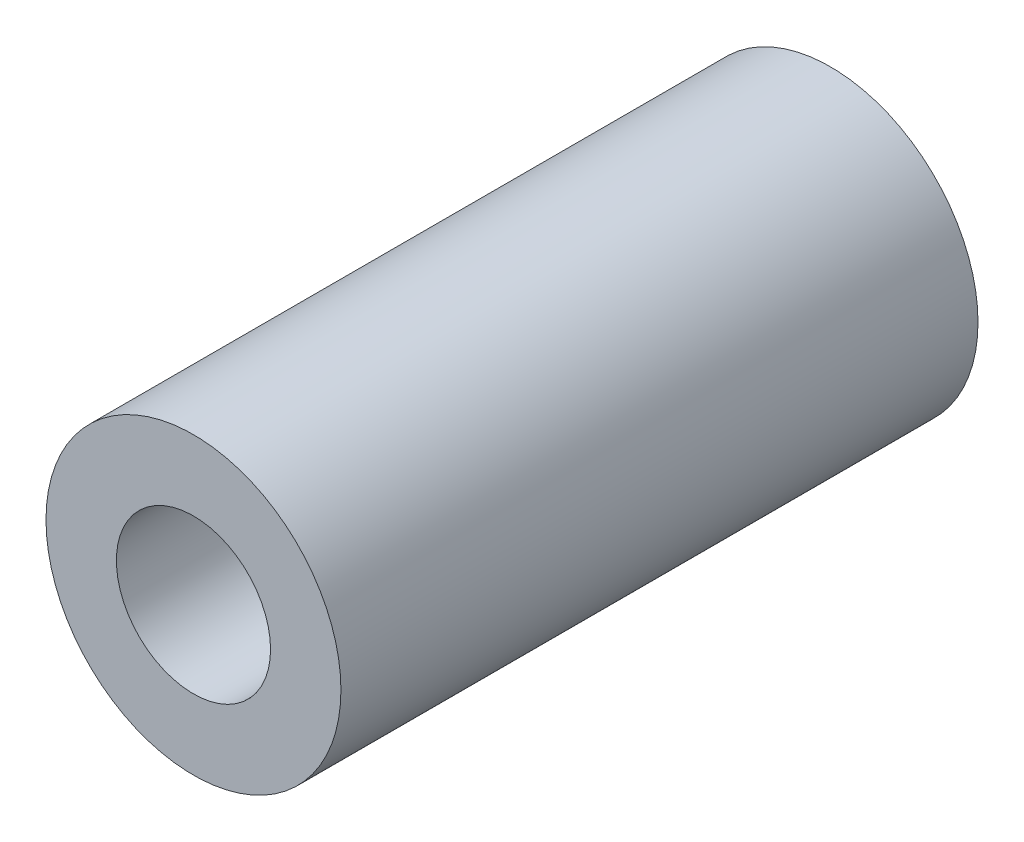
ISO-10303-21;
HEADER;
FILE_DESCRIPTION(('STEP AP214'),'2;1');
FILE_NAME('part.step','',(''),(''),'','','');
FILE_SCHEMA(('AUTOMOTIVE_DESIGN { 1 0 10303 214 1 1 1 1 }'));
ENDSEC;
DATA;
#1=APPLICATION_CONTEXT('core data for automotive mechanical design processes');
#2=APPLICATION_PROTOCOL_DEFINITION('international standard','automotive_design',2000,#1);
#3=PRODUCT_CONTEXT('',#1,'mechanical');
#4=PRODUCT('Part','Part','',(#3));
#5=PRODUCT_RELATED_PRODUCT_CATEGORY('part','',(#4));
#6=PRODUCT_DEFINITION_FORMATION('','',#4);
#7=PRODUCT_DEFINITION_CONTEXT('part definition',#1,'design');
#8=PRODUCT_DEFINITION('design','',#6,#7);
#9=PRODUCT_DEFINITION_SHAPE('','',#8);
#10=(LENGTH_UNIT() NAMED_UNIT(*) SI_UNIT(.MILLI.,.METRE.));
#11=(NAMED_UNIT(*) PLANE_ANGLE_UNIT() SI_UNIT($,.RADIAN.));
#12=(NAMED_UNIT(*) SI_UNIT($,.STERADIAN.) SOLID_ANGLE_UNIT());
#13=UNCERTAINTY_MEASURE_WITH_UNIT(LENGTH_MEASURE(1.E-05),#10,'distance_accuracy_value','');
#14=(GEOMETRIC_REPRESENTATION_CONTEXT(3) GLOBAL_UNCERTAINTY_ASSIGNED_CONTEXT((#13)) GLOBAL_UNIT_ASSIGNED_CONTEXT((#10,
#11,#12)) REPRESENTATION_CONTEXT('',''));
#15=CARTESIAN_POINT('',(0.,0.,0.));
#16=DIRECTION('',(0.,0.,1.));
#17=DIRECTION('',(1.,0.,0.));
#18=AXIS2_PLACEMENT_3D('',#15,#16,#17);
#19=CARTESIAN_POINT('',(0.,0.,10.287));
#20=DIRECTION('',(0.,0.,1.));
#21=DIRECTION('',(1.,0.,0.));
#22=AXIS2_PLACEMENT_3D('',#19,#20,#21);
#23=PLANE('',#22);
#24=CARTESIAN_POINT('',(0.,0.,10.287));
#25=DIRECTION('',(0.,0.,1.));
#26=DIRECTION('',(1.,0.,0.));
#27=AXIS2_PLACEMENT_3D('',#24,#25,#26);
#28=CIRCLE('',#27,4.7625);
#29=CARTESIAN_POINT('',(4.7625,0.,10.287));
#30=VERTEX_POINT('',#29);
#31=EDGE_CURVE('E10',#30,#30,#28,.T.);
#32=ORIENTED_EDGE('',*,*,#31,.T.);
#33=EDGE_LOOP('',(#32));
#34=FACE_BOUND('',#33,.T.);
#35=CARTESIAN_POINT('',(0.,0.,10.287));
#36=DIRECTION('',(0.,0.,1.));
#37=DIRECTION('',(1.,0.,0.));
#38=AXIS2_PLACEMENT_3D('',#35,#36,#37);
#39=CIRCLE('',#38,2.4892);
#40=CARTESIAN_POINT('',(2.4892,0.,10.287));
#41=VERTEX_POINT('',#40);
#42=EDGE_CURVE('E46',#41,#41,#39,.T.);
#43=ORIENTED_EDGE('',*,*,#42,.F.);
#44=EDGE_LOOP('',(#43));
#45=FACE_BOUND('',#44,.T.);
#46=ADVANCED_FACE('F35',(#34,#45),#23,.T.);
#47=CARTESIAN_POINT('',(0.,0.,-10.287));
#48=DIRECTION('',(0.,0.,1.));
#49=DIRECTION('',(1.,0.,0.));
#50=AXIS2_PLACEMENT_3D('',#47,#48,#49);
#51=PLANE('',#50);
#52=CARTESIAN_POINT('',(0.,0.,-10.287));
#53=DIRECTION('',(0.,0.,1.));
#54=DIRECTION('',(1.,0.,0.));
#55=AXIS2_PLACEMENT_3D('',#52,#53,#54);
#56=CIRCLE('',#55,4.7625);
#57=CARTESIAN_POINT('',(4.7625,0.,-10.287));
#58=VERTEX_POINT('',#57);
#59=EDGE_CURVE('E39',#58,#58,#56,.T.);
#60=ORIENTED_EDGE('',*,*,#59,.F.);
#61=EDGE_LOOP('',(#60));
#62=FACE_BOUND('',#61,.T.);
#63=CARTESIAN_POINT('',(0.,0.,-10.287));
#64=DIRECTION('',(0.,0.,1.));
#65=DIRECTION('',(1.,0.,0.));
#66=AXIS2_PLACEMENT_3D('',#63,#64,#65);
#67=CIRCLE('',#66,2.4892);
#68=CARTESIAN_POINT('',(2.4892,0.,-10.287));
#69=VERTEX_POINT('',#68);
#70=EDGE_CURVE('E48',#69,#69,#67,.T.);
#71=ORIENTED_EDGE('',*,*,#70,.T.);
#72=EDGE_LOOP('',(#71));
#73=FACE_BOUND('',#72,.T.);
#74=ADVANCED_FACE('F58',(#62,#73),#51,.F.);
#75=CARTESIAN_POINT('',(0.,0.,10.287));
#76=DIRECTION('',(0.,0.,-1.));
#77=DIRECTION('',(-1.,0.,0.));
#78=AXIS2_PLACEMENT_3D('',#75,#76,#77);
#79=CYLINDRICAL_SURFACE('',#78,4.7625);
#80=ORIENTED_EDGE('',*,*,#31,.F.);
#81=EDGE_LOOP('',(#80));
#82=FACE_BOUND('',#81,.T.);
#83=ORIENTED_EDGE('',*,*,#59,.T.);
#84=EDGE_LOOP('',(#83));
#85=FACE_BOUND('',#84,.T.);
#86=ADVANCED_FACE('F37',(#82,#85),#79,.T.);
#87=CARTESIAN_POINT('',(0.,0.,10.287));
#88=DIRECTION('',(0.,0.,-1.));
#89=DIRECTION('',(-1.,0.,0.));
#90=AXIS2_PLACEMENT_3D('',#87,#88,#89);
#91=CYLINDRICAL_SURFACE('',#90,2.4892);
#92=ORIENTED_EDGE('',*,*,#42,.T.);
#93=EDGE_LOOP('',(#92));
#94=FACE_BOUND('',#93,.T.);
#95=ORIENTED_EDGE('',*,*,#70,.F.);
#96=EDGE_LOOP('',(#95));
#97=FACE_BOUND('',#96,.T.);
#98=ADVANCED_FACE('F54',(#94,#97),#91,.F.);
#99=CLOSED_SHELL('',(#46,#74,#86,#98));
#100=MANIFOLD_SOLID_BREP('B2',#99);
#101=ADVANCED_BREP_SHAPE_REPRESENTATION('',(#18,#100),#14);
#102=SHAPE_DEFINITION_REPRESENTATION(#9,#101);
ENDSEC;
END-ISO-10303-21;
